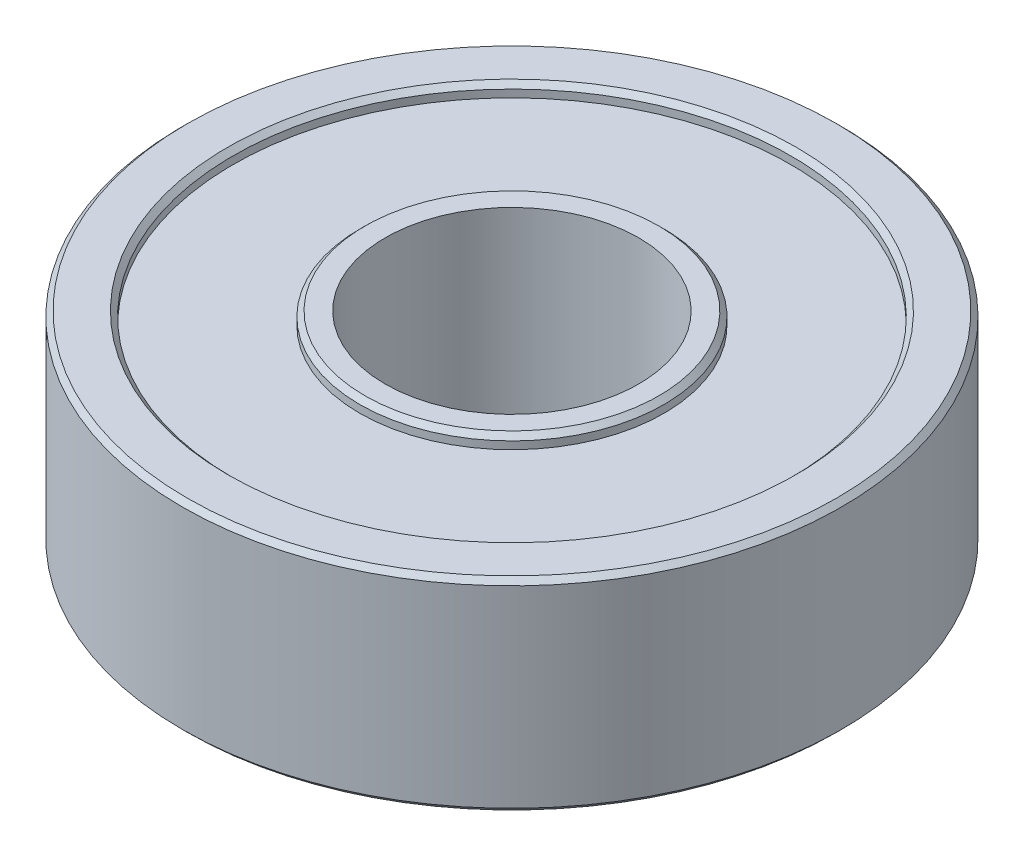
ISO-10303-21;
HEADER;
FILE_DESCRIPTION(('STEP AP214'),'2;1');
FILE_NAME('part.step','',(''),(''),'','','');
FILE_SCHEMA(('AUTOMOTIVE_DESIGN { 1 0 10303 214 1 1 1 1 }'));
ENDSEC;
DATA;
#1=APPLICATION_CONTEXT('core data for automotive mechanical design processes');
#2=APPLICATION_PROTOCOL_DEFINITION('international standard','automotive_design',2000,#1);
#3=PRODUCT_CONTEXT('',#1,'mechanical');
#4=PRODUCT('Part','Part','',(#3));
#5=PRODUCT_RELATED_PRODUCT_CATEGORY('part','',(#4));
#6=PRODUCT_DEFINITION_FORMATION('','',#4);
#7=PRODUCT_DEFINITION_CONTEXT('part definition',#1,'design');
#8=PRODUCT_DEFINITION('design','',#6,#7);
#9=PRODUCT_DEFINITION_SHAPE('','',#8);
#10=(LENGTH_UNIT() NAMED_UNIT(*) SI_UNIT(.MILLI.,.METRE.));
#11=(NAMED_UNIT(*) PLANE_ANGLE_UNIT() SI_UNIT($,.RADIAN.));
#12=(NAMED_UNIT(*) SI_UNIT($,.STERADIAN.) SOLID_ANGLE_UNIT());
#13=UNCERTAINTY_MEASURE_WITH_UNIT(LENGTH_MEASURE(1.E-05),#10,'distance_accuracy_value','');
#14=(GEOMETRIC_REPRESENTATION_CONTEXT(3) GLOBAL_UNCERTAINTY_ASSIGNED_CONTEXT((#13)) GLOBAL_UNIT_ASSIGNED_CONTEXT((#10,
#11,#12)) REPRESENTATION_CONTEXT('',''));
#15=CARTESIAN_POINT('',(0.,0.,0.));
#16=DIRECTION('',(0.,0.,1.));
#17=DIRECTION('',(1.,0.,0.));
#18=AXIS2_PLACEMENT_3D('',#15,#16,#17);
#19=CARTESIAN_POINT('',(0.,0.,0.));
#20=DIRECTION('',(0.,1.,0.));
#21=DIRECTION('',(0.,0.,1.));
#22=AXIS2_PLACEMENT_3D('',#19,#20,#21);
#23=PLANE('',#22);
#24=CARTESIAN_POINT('',(0.,0.,0.));
#25=DIRECTION('',(0.,1.,0.));
#26=DIRECTION('',(0.,0.,1.));
#27=AXIS2_PLACEMENT_3D('',#24,#25,#26);
#28=CIRCLE('',#27,5.8);
#29=CARTESIAN_POINT('',(0.,0.,5.8));
#30=VERTEX_POINT('',#29);
#31=EDGE_CURVE('E80',#30,#30,#28,.F.);
#32=ORIENTED_EDGE('',*,*,#31,.T.);
#33=EDGE_LOOP('',(#32));
#34=FACE_BOUND('',#33,.T.);
#35=CARTESIAN_POINT('',(0.,0.,0.));
#36=DIRECTION('',(0.,1.,0.));
#37=DIRECTION('',(0.,0.,1.));
#38=AXIS2_PLACEMENT_3D('',#35,#36,#37);
#39=CIRCLE('',#38,5.);
#40=CARTESIAN_POINT('',(0.,0.,5.));
#41=VERTEX_POINT('',#40);
#42=EDGE_CURVE('E101',#41,#41,#39,.T.);
#43=ORIENTED_EDGE('',*,*,#42,.T.);
#44=EDGE_LOOP('',(#43));
#45=FACE_BOUND('',#44,.T.);
#46=ADVANCED_FACE('F43',(#34,#45),#23,.F.);
#47=CARTESIAN_POINT('',(0.,8.,0.));
#48=DIRECTION('',(0.,1.,0.));
#49=DIRECTION('',(0.,0.,1.));
#50=AXIS2_PLACEMENT_3D('',#47,#48,#49);
#51=PLANE('',#50);
#52=CARTESIAN_POINT('',(0.,8.,0.));
#53=DIRECTION('',(0.,1.,0.));
#54=DIRECTION('',(0.,0.,1.));
#55=AXIS2_PLACEMENT_3D('',#52,#53,#54);
#56=CIRCLE('',#55,5.80000000000001);
#57=CARTESIAN_POINT('',(0.,8.,5.80000000000001));
#58=VERTEX_POINT('',#57);
#59=EDGE_CURVE('E76',#58,#58,#56,.T.);
#60=ORIENTED_EDGE('',*,*,#59,.T.);
#61=EDGE_LOOP('',(#60));
#62=FACE_BOUND('',#61,.T.);
#63=CARTESIAN_POINT('',(0.,8.,0.));
#64=DIRECTION('',(0.,1.,0.));
#65=DIRECTION('',(0.,0.,1.));
#66=AXIS2_PLACEMENT_3D('',#63,#64,#65);
#67=CIRCLE('',#66,5.);
#68=CARTESIAN_POINT('',(0.,8.,5.));
#69=VERTEX_POINT('',#68);
#70=EDGE_CURVE('E100',#69,#69,#67,.T.);
#71=ORIENTED_EDGE('',*,*,#70,.F.);
#72=EDGE_LOOP('',(#71));
#73=FACE_BOUND('',#72,.T.);
#74=ADVANCED_FACE('F144',(#62,#73),#51,.T.);
#75=CARTESIAN_POINT('',(0.,8.,0.));
#76=DIRECTION('',(0.,1.,0.));
#77=DIRECTION('',(0.,0.,1.));
#78=AXIS2_PLACEMENT_3D('',#75,#76,#77);
#79=CIRCLE('',#78,11.2);
#80=CARTESIAN_POINT('',(0.,8.,11.2));
#81=VERTEX_POINT('',#80);
#82=EDGE_CURVE('E88',#81,#81,#79,.F.);
#83=ORIENTED_EDGE('',*,*,#82,.T.);
#84=EDGE_LOOP('',(#83));
#85=FACE_BOUND('',#84,.T.);
#86=CARTESIAN_POINT('',(0.,8.,0.));
#87=DIRECTION('',(0.,1.,0.));
#88=DIRECTION('',(0.,0.,1.));
#89=AXIS2_PLACEMENT_3D('',#86,#87,#88);
#90=CIRCLE('',#89,12.8);
#91=CARTESIAN_POINT('',(0.,8.,12.8));
#92=VERTEX_POINT('',#91);
#93=EDGE_CURVE('E92',#92,#92,#90,.T.);
#94=ORIENTED_EDGE('',*,*,#93,.T.);
#95=EDGE_LOOP('',(#94));
#96=FACE_BOUND('',#95,.T.);
#97=ADVANCED_FACE('F151',(#85,#96),#51,.T.);
#98=CARTESIAN_POINT('',(0.,0.,0.));
#99=DIRECTION('',(0.,1.,0.));
#100=DIRECTION('',(0.,0.,1.));
#101=AXIS2_PLACEMENT_3D('',#98,#99,#100);
#102=CIRCLE('',#101,11.2);
#103=CARTESIAN_POINT('',(0.,0.,11.2));
#104=VERTEX_POINT('',#103);
#105=EDGE_CURVE('E62',#104,#104,#102,.T.);
#106=ORIENTED_EDGE('',*,*,#105,.T.);
#107=EDGE_LOOP('',(#106));
#108=FACE_BOUND('',#107,.T.);
#109=CARTESIAN_POINT('',(0.,0.,0.));
#110=DIRECTION('',(0.,1.,0.));
#111=DIRECTION('',(0.,0.,1.));
#112=AXIS2_PLACEMENT_3D('',#109,#110,#111);
#113=CIRCLE('',#112,12.8);
#114=CARTESIAN_POINT('',(0.,0.,12.8));
#115=VERTEX_POINT('',#114);
#116=EDGE_CURVE('E68',#115,#115,#113,.F.);
#117=ORIENTED_EDGE('',*,*,#116,.T.);
#118=EDGE_LOOP('',(#117));
#119=FACE_BOUND('',#118,.T.);
#120=ADVANCED_FACE('F147',(#108,#119),#23,.F.);
#121=CARTESIAN_POINT('',(0.,8.,0.));
#122=DIRECTION('',(0.,-1.,0.));
#123=DIRECTION('',(0.,0.,-1.));
#124=AXIS2_PLACEMENT_3D('',#121,#122,#123);
#125=CYLINDRICAL_SURFACE('',#124,13.);
#126=CARTESIAN_POINT('',(0.,0.200000000000002,0.));
#127=DIRECTION('',(0.,1.,0.));
#128=DIRECTION('',(0.,0.,1.));
#129=AXIS2_PLACEMENT_3D('',#126,#127,#128);
#130=CIRCLE('',#129,13.);
#131=CARTESIAN_POINT('',(0.,0.200000000000002,13.));
#132=VERTEX_POINT('',#131);
#133=EDGE_CURVE('E10',#132,#132,#130,.T.);
#134=ORIENTED_EDGE('',*,*,#133,.T.);
#135=EDGE_LOOP('',(#134));
#136=FACE_BOUND('',#135,.T.);
#137=CARTESIAN_POINT('',(0.,7.8,0.));
#138=DIRECTION('',(0.,1.,0.));
#139=DIRECTION('',(0.,0.,1.));
#140=AXIS2_PLACEMENT_3D('',#137,#138,#139);
#141=CIRCLE('',#140,13.);
#142=CARTESIAN_POINT('',(0.,7.8,13.));
#143=VERTEX_POINT('',#142);
#144=EDGE_CURVE('E52',#143,#143,#141,.F.);
#145=ORIENTED_EDGE('',*,*,#144,.T.);
#146=EDGE_LOOP('',(#145));
#147=FACE_BOUND('',#146,.T.);
#148=ADVANCED_FACE('F157',(#136,#147),#125,.T.);
#149=CARTESIAN_POINT('',(0.,8.,0.));
#150=DIRECTION('',(0.,-1.,0.));
#151=DIRECTION('',(0.,0.,-1.));
#152=AXIS2_PLACEMENT_3D('',#149,#150,#151);
#153=CYLINDRICAL_SURFACE('',#152,5.);
#154=ORIENTED_EDGE('',*,*,#70,.T.);
#155=EDGE_LOOP('',(#154));
#156=FACE_BOUND('',#155,.T.);
#157=ORIENTED_EDGE('',*,*,#42,.F.);
#158=EDGE_LOOP('',(#157));
#159=FACE_BOUND('',#158,.T.);
#160=ADVANCED_FACE('F163',(#156,#159),#153,.F.);
#161=CARTESIAN_POINT('',(0.,7.5,0.));
#162=DIRECTION('',(0.,1.,0.));
#163=DIRECTION('',(0.,0.,1.));
#164=AXIS2_PLACEMENT_3D('',#161,#162,#163);
#165=CYLINDRICAL_SURFACE('',#164,11.);
#166=CARTESIAN_POINT('',(0.,7.8,0.));
#167=DIRECTION('',(0.,1.,0.));
#168=DIRECTION('',(0.,0.,1.));
#169=AXIS2_PLACEMENT_3D('',#166,#167,#168);
#170=CIRCLE('',#169,11.);
#171=CARTESIAN_POINT('',(0.,7.8,11.));
#172=VERTEX_POINT('',#171);
#173=EDGE_CURVE('E96',#172,#172,#170,.T.);
#174=ORIENTED_EDGE('',*,*,#173,.T.);
#175=EDGE_LOOP('',(#174));
#176=FACE_BOUND('',#175,.T.);
#177=CARTESIAN_POINT('',(0.,7.5,0.));
#178=DIRECTION('',(0.,1.,0.));
#179=DIRECTION('',(0.,0.,1.));
#180=AXIS2_PLACEMENT_3D('',#177,#178,#179);
#181=CIRCLE('',#180,11.);
#182=CARTESIAN_POINT('',(0.,7.5,11.));
#183=VERTEX_POINT('',#182);
#184=EDGE_CURVE('E105',#183,#183,#181,.T.);
#185=ORIENTED_EDGE('',*,*,#184,.F.);
#186=EDGE_LOOP('',(#185));
#187=FACE_BOUND('',#186,.T.);
#188=ADVANCED_FACE('F235',(#176,#187),#165,.F.);
#189=CARTESIAN_POINT('',(0.,7.5,0.));
#190=DIRECTION('',(0.,1.,0.));
#191=DIRECTION('',(0.,0.,1.));
#192=AXIS2_PLACEMENT_3D('',#189,#190,#191);
#193=PLANE('',#192);
#194=CARTESIAN_POINT('',(0.,7.5,0.));
#195=DIRECTION('',(0.,1.,0.));
#196=DIRECTION('',(0.,0.,1.));
#197=AXIS2_PLACEMENT_3D('',#194,#195,#196);
#198=CIRCLE('',#197,6.);
#199=CARTESIAN_POINT('',(0.,7.5,6.));
#200=VERTEX_POINT('',#199);
#201=EDGE_CURVE('E112',#200,#200,#198,.T.);
#202=ORIENTED_EDGE('',*,*,#201,.F.);
#203=EDGE_LOOP('',(#202));
#204=FACE_BOUND('',#203,.T.);
#205=ORIENTED_EDGE('',*,*,#184,.T.);
#206=EDGE_LOOP('',(#205));
#207=FACE_BOUND('',#206,.T.);
#208=ADVANCED_FACE('F240',(#204,#207),#193,.T.);
#209=CARTESIAN_POINT('',(0.,7.5,0.));
#210=DIRECTION('',(0.,1.,0.));
#211=DIRECTION('',(0.,0.,1.));
#212=AXIS2_PLACEMENT_3D('',#209,#210,#211);
#213=CYLINDRICAL_SURFACE('',#212,6.);
#214=CARTESIAN_POINT('',(0.,7.8,0.));
#215=DIRECTION('',(0.,1.,0.));
#216=DIRECTION('',(0.,0.,1.));
#217=AXIS2_PLACEMENT_3D('',#214,#215,#216);
#218=CIRCLE('',#217,6.);
#219=CARTESIAN_POINT('',(0.,7.8,6.));
#220=VERTEX_POINT('',#219);
#221=EDGE_CURVE('E72',#220,#220,#218,.F.);
#222=ORIENTED_EDGE('',*,*,#221,.T.);
#223=EDGE_LOOP('',(#222));
#224=FACE_BOUND('',#223,.T.);
#225=ORIENTED_EDGE('',*,*,#201,.T.);
#226=EDGE_LOOP('',(#225));
#227=FACE_BOUND('',#226,.T.);
#228=ADVANCED_FACE('F265',(#224,#227),#213,.T.);
#229=CARTESIAN_POINT('',(0.,0.5,0.));
#230=DIRECTION('',(0.,1.,0.));
#231=DIRECTION('',(0.,0.,1.));
#232=AXIS2_PLACEMENT_3D('',#229,#230,#231);
#233=PLANE('',#232);
#234=CARTESIAN_POINT('',(0.,0.5,0.));
#235=DIRECTION('',(0.,1.,0.));
#236=DIRECTION('',(0.,0.,1.));
#237=AXIS2_PLACEMENT_3D('',#234,#235,#236);
#238=CIRCLE('',#237,11.);
#239=CARTESIAN_POINT('',(0.,0.5,11.));
#240=VERTEX_POINT('',#239);
#241=EDGE_CURVE('E116',#240,#240,#238,.T.);
#242=ORIENTED_EDGE('',*,*,#241,.F.);
#243=EDGE_LOOP('',(#242));
#244=FACE_BOUND('',#243,.T.);
#245=CARTESIAN_POINT('',(0.,0.5,0.));
#246=DIRECTION('',(0.,1.,0.));
#247=DIRECTION('',(0.,0.,1.));
#248=AXIS2_PLACEMENT_3D('',#245,#246,#247);
#249=CIRCLE('',#248,6.);
#250=CARTESIAN_POINT('',(0.,0.5,6.));
#251=VERTEX_POINT('',#250);
#252=EDGE_CURVE('E120',#251,#251,#249,.T.);
#253=ORIENTED_EDGE('',*,*,#252,.T.);
#254=EDGE_LOOP('',(#253));
#255=FACE_BOUND('',#254,.T.);
#256=ADVANCED_FACE('F125',(#244,#255),#233,.F.);
#257=CARTESIAN_POINT('',(0.,0.5,0.));
#258=DIRECTION('',(0.,-1.,0.));
#259=DIRECTION('',(0.,0.,-1.));
#260=AXIS2_PLACEMENT_3D('',#257,#258,#259);
#261=CYLINDRICAL_SURFACE('',#260,11.);
#262=CARTESIAN_POINT('',(0.,0.200000000000001,0.));
#263=DIRECTION('',(0.,1.,0.));
#264=DIRECTION('',(0.,0.,1.));
#265=AXIS2_PLACEMENT_3D('',#262,#263,#264);
#266=CIRCLE('',#265,11.);
#267=CARTESIAN_POINT('',(0.,0.200000000000001,11.));
#268=VERTEX_POINT('',#267);
#269=EDGE_CURVE('E57',#268,#268,#266,.F.);
#270=ORIENTED_EDGE('',*,*,#269,.T.);
#271=EDGE_LOOP('',(#270));
#272=FACE_BOUND('',#271,.T.);
#273=ORIENTED_EDGE('',*,*,#241,.T.);
#274=EDGE_LOOP('',(#273));
#275=FACE_BOUND('',#274,.T.);
#276=ADVANCED_FACE('F130',(#272,#275),#261,.F.);
#277=CARTESIAN_POINT('',(0.,0.5,0.));
#278=DIRECTION('',(0.,-1.,0.));
#279=DIRECTION('',(0.,0.,-1.));
#280=AXIS2_PLACEMENT_3D('',#277,#278,#279);
#281=CYLINDRICAL_SURFACE('',#280,6.);
#282=CARTESIAN_POINT('',(0.,0.200000000000001,0.));
#283=DIRECTION('',(0.,1.,0.));
#284=DIRECTION('',(0.,0.,1.));
#285=AXIS2_PLACEMENT_3D('',#282,#283,#284);
#286=CIRCLE('',#285,6.);
#287=CARTESIAN_POINT('',(0.,0.200000000000001,6.));
#288=VERTEX_POINT('',#287);
#289=EDGE_CURVE('E84',#288,#288,#286,.T.);
#290=ORIENTED_EDGE('',*,*,#289,.T.);
#291=EDGE_LOOP('',(#290));
#292=FACE_BOUND('',#291,.T.);
#293=ORIENTED_EDGE('',*,*,#252,.F.);
#294=EDGE_LOOP('',(#293));
#295=FACE_BOUND('',#294,.T.);
#296=ADVANCED_FACE('F127',(#292,#295),#281,.T.);
#297=CARTESIAN_POINT('',(0.,7.8,0.));
#298=DIRECTION('',(0.,1.,0.));
#299=DIRECTION('',(0.,0.,1.));
#300=AXIS2_PLACEMENT_3D('',#297,#298,#299);
#301=CONICAL_SURFACE('',#300,11.,0.78539816339744);
#302=ORIENTED_EDGE('',*,*,#82,.F.);
#303=EDGE_LOOP('',(#302));
#304=FACE_BOUND('',#303,.T.);
#305=ORIENTED_EDGE('',*,*,#173,.F.);
#306=EDGE_LOOP('',(#305));
#307=FACE_BOUND('',#306,.T.);
#308=ADVANCED_FACE('F129',(#304,#307),#301,.F.);
#309=CARTESIAN_POINT('',(0.,0.200000000000001,0.));
#310=DIRECTION('',(0.,1.,0.));
#311=DIRECTION('',(0.,0.,1.));
#312=AXIS2_PLACEMENT_3D('',#309,#310,#311);
#313=CONICAL_SURFACE('',#312,6.,0.785398163397448);
#314=ORIENTED_EDGE('',*,*,#31,.F.);
#315=EDGE_LOOP('',(#314));
#316=FACE_BOUND('',#315,.T.);
#317=ORIENTED_EDGE('',*,*,#289,.F.);
#318=EDGE_LOOP('',(#317));
#319=FACE_BOUND('',#318,.T.);
#320=ADVANCED_FACE('F137',(#316,#319),#313,.T.);
#321=CARTESIAN_POINT('',(0.,8.,0.));
#322=DIRECTION('',(0.,-1.,0.));
#323=DIRECTION('',(0.,0.,-1.));
#324=AXIS2_PLACEMENT_3D('',#321,#322,#323);
#325=CONICAL_SURFACE('',#324,5.80000000000001,0.785398163397444);
#326=ORIENTED_EDGE('',*,*,#221,.F.);
#327=EDGE_LOOP('',(#326));
#328=FACE_BOUND('',#327,.T.);
#329=ORIENTED_EDGE('',*,*,#59,.F.);
#330=EDGE_LOOP('',(#329));
#331=FACE_BOUND('',#330,.T.);
#332=ADVANCED_FACE('F178',(#328,#331),#325,.T.);
#333=CARTESIAN_POINT('',(0.,0.,0.));
#334=DIRECTION('',(0.,-1.,0.));
#335=DIRECTION('',(0.,0.,-1.));
#336=AXIS2_PLACEMENT_3D('',#333,#334,#335);
#337=CONICAL_SURFACE('',#336,11.2,0.785398163397444);
#338=ORIENTED_EDGE('',*,*,#269,.F.);
#339=EDGE_LOOP('',(#338));
#340=FACE_BOUND('',#339,.T.);
#341=ORIENTED_EDGE('',*,*,#105,.F.);
#342=EDGE_LOOP('',(#341));
#343=FACE_BOUND('',#342,.T.);
#344=ADVANCED_FACE('F172',(#340,#343),#337,.F.);
#345=CARTESIAN_POINT('',(0.,0.200000000000002,0.));
#346=DIRECTION('',(0.,1.,0.));
#347=DIRECTION('',(0.,0.,1.));
#348=AXIS2_PLACEMENT_3D('',#345,#346,#347);
#349=CONICAL_SURFACE('',#348,13.,0.785398163397444);
#350=ORIENTED_EDGE('',*,*,#116,.F.);
#351=EDGE_LOOP('',(#350));
#352=FACE_BOUND('',#351,.T.);
#353=ORIENTED_EDGE('',*,*,#133,.F.);
#354=EDGE_LOOP('',(#353));
#355=FACE_BOUND('',#354,.T.);
#356=ADVANCED_FACE('F169',(#352,#355),#349,.T.);
#357=CARTESIAN_POINT('',(0.,8.,0.));
#358=DIRECTION('',(0.,-1.,0.));
#359=DIRECTION('',(0.,0.,-1.));
#360=AXIS2_PLACEMENT_3D('',#357,#358,#359);
#361=CONICAL_SURFACE('',#360,12.8,0.78539816339744);
#362=ORIENTED_EDGE('',*,*,#144,.F.);
#363=EDGE_LOOP('',(#362));
#364=FACE_BOUND('',#363,.T.);
#365=ORIENTED_EDGE('',*,*,#93,.F.);
#366=EDGE_LOOP('',(#365));
#367=FACE_BOUND('',#366,.T.);
#368=ADVANCED_FACE('F46',(#364,#367),#361,.T.);
#369=CLOSED_SHELL('',(#46,#74,#97,#120,#148,#160,#188,#208,#228,#256,#276,#296,#308,#320,#332,
#344,#356,#368));
#370=MANIFOLD_SOLID_BREP('B2',#369);
#371=ADVANCED_BREP_SHAPE_REPRESENTATION('',(#18,#370),#14);
#372=SHAPE_DEFINITION_REPRESENTATION(#9,#371);
ENDSEC;
END-ISO-10303-21;
